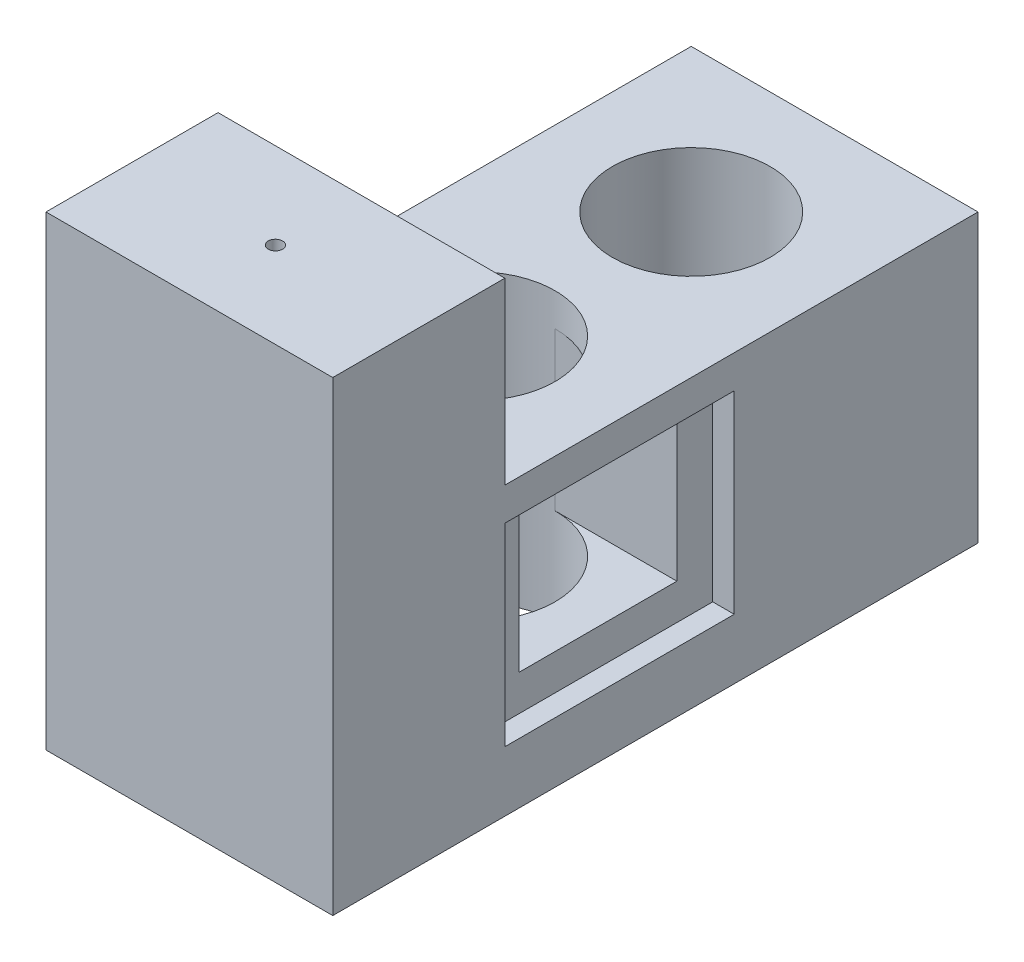
ISO-10303-21;
HEADER;
FILE_DESCRIPTION(('STEP AP214'),'2;1');
FILE_NAME('part.step','',(''),(''),'','','');
FILE_SCHEMA(('AUTOMOTIVE_DESIGN { 1 0 10303 214 1 1 1 1 }'));
ENDSEC;
DATA;
#1=APPLICATION_CONTEXT('core data for automotive mechanical design processes');
#2=APPLICATION_PROTOCOL_DEFINITION('international standard','automotive_design',2000,#1);
#3=PRODUCT_CONTEXT('',#1,'mechanical');
#4=PRODUCT('Part','Part','',(#3));
#5=PRODUCT_RELATED_PRODUCT_CATEGORY('part','',(#4));
#6=PRODUCT_DEFINITION_FORMATION('','',#4);
#7=PRODUCT_DEFINITION_CONTEXT('part definition',#1,'design');
#8=PRODUCT_DEFINITION('design','',#6,#7);
#9=PRODUCT_DEFINITION_SHAPE('','',#8);
#10=(LENGTH_UNIT() NAMED_UNIT(*) SI_UNIT(.MILLI.,.METRE.));
#11=(NAMED_UNIT(*) PLANE_ANGLE_UNIT() SI_UNIT($,.RADIAN.));
#12=(NAMED_UNIT(*) SI_UNIT($,.STERADIAN.) SOLID_ANGLE_UNIT());
#13=UNCERTAINTY_MEASURE_WITH_UNIT(LENGTH_MEASURE(1.E-05),#10,'distance_accuracy_value','');
#14=(GEOMETRIC_REPRESENTATION_CONTEXT(3) GLOBAL_UNCERTAINTY_ASSIGNED_CONTEXT((#13)) GLOBAL_UNIT_ASSIGNED_CONTEXT((#10,
#11,#12)) REPRESENTATION_CONTEXT('',''));
#15=CARTESIAN_POINT('',(0.,0.,0.));
#16=DIRECTION('',(0.,0.,1.));
#17=DIRECTION('',(1.,0.,0.));
#18=AXIS2_PLACEMENT_3D('',#15,#16,#17);
#19=CARTESIAN_POINT('',(-428.226450017831,17.7,-13.030180121313));
#20=DIRECTION('',(0.,0.,1.));
#21=DIRECTION('',(1.,0.,0.));
#22=AXIS2_PLACEMENT_3D('',#19,#20,#21);
#23=PLANE('',#22);
#24=DIRECTION('',(0.,1.,0.));
#25=VECTOR('',#24,1.);
#26=CARTESIAN_POINT('',(-419.726450017831,17.7,-13.030180121313));
#27=LINE('',#26,#25);
#28=CARTESIAN_POINT('',(-419.726450017831,6.69999999999999,-13.030180121313));
#29=VERTEX_POINT('',#28);
#30=CARTESIAN_POINT('',(-419.726450017831,17.7,-13.030180121313));
#31=VERTEX_POINT('',#30);
#32=EDGE_CURVE('E184',#29,#31,#27,.T.);
#33=ORIENTED_EDGE('',*,*,#32,.F.);
#34=DIRECTION('',(1.,0.,0.));
#35=VECTOR('',#34,1.);
#36=CARTESIAN_POINT('',(-428.226450017831,6.69999999999999,-13.030180121313));
#37=LINE('',#36,#35);
#38=CARTESIAN_POINT('',(-428.226450017831,6.69999999999999,-13.030180121313));
#39=VERTEX_POINT('',#38);
#40=EDGE_CURVE('E192',#39,#29,#37,.T.);
#41=ORIENTED_EDGE('',*,*,#40,.F.);
#42=DIRECTION('',(0.,-1.,0.));
#43=VECTOR('',#42,1.);
#44=CARTESIAN_POINT('',(-428.226450017831,17.7,-13.030180121313));
#45=LINE('',#44,#43);
#46=CARTESIAN_POINT('',(-428.226450017831,17.7,-13.030180121313));
#47=VERTEX_POINT('',#46);
#48=EDGE_CURVE('E186',#47,#39,#45,.T.);
#49=ORIENTED_EDGE('',*,*,#48,.F.);
#50=DIRECTION('',(1.,0.,0.));
#51=VECTOR('',#50,1.);
#52=CARTESIAN_POINT('',(-428.226450017831,17.7,-13.030180121313));
#53=LINE('',#52,#51);
#54=EDGE_CURVE('E193',#47,#31,#53,.T.);
#55=ORIENTED_EDGE('',*,*,#54,.T.);
#56=EDGE_LOOP('',(#33,#41,#49,#55));
#57=FACE_BOUND('',#56,.T.);
#58=ADVANCED_FACE('F41',(#57),#23,.F.);
#59=CARTESIAN_POINT('',(-428.226450017831,17.7,-24.030180121313));
#60=DIRECTION('',(0.,0.,-1.));
#61=DIRECTION('',(-1.,0.,0.));
#62=AXIS2_PLACEMENT_3D('',#59,#60,#61);
#63=PLANE('',#62);
#64=DIRECTION('',(0.,-1.,0.));
#65=VECTOR('',#64,1.);
#66=CARTESIAN_POINT('',(-419.726450017831,17.7,-24.030180121313));
#67=LINE('',#66,#65);
#68=CARTESIAN_POINT('',(-419.726450017831,17.7,-24.030180121313));
#69=VERTEX_POINT('',#68);
#70=CARTESIAN_POINT('',(-419.726450017831,6.69999999999999,-24.030180121313));
#71=VERTEX_POINT('',#70);
#72=EDGE_CURVE('E55',#69,#71,#67,.T.);
#73=ORIENTED_EDGE('',*,*,#72,.F.);
#74=DIRECTION('',(1.,0.,0.));
#75=VECTOR('',#74,1.);
#76=CARTESIAN_POINT('',(-428.226450017831,17.7,-24.030180121313));
#77=LINE('',#76,#75);
#78=CARTESIAN_POINT('',(-428.226450017831,17.7,-24.030180121313));
#79=VERTEX_POINT('',#78);
#80=EDGE_CURVE('E62',#79,#69,#77,.T.);
#81=ORIENTED_EDGE('',*,*,#80,.F.);
#82=DIRECTION('',(0.,1.,0.));
#83=VECTOR('',#82,1.);
#84=CARTESIAN_POINT('',(-428.226450017831,17.7,-24.030180121313));
#85=LINE('',#84,#83);
#86=CARTESIAN_POINT('',(-428.226450017831,6.69999999999999,-24.030180121313));
#87=VERTEX_POINT('',#86);
#88=EDGE_CURVE('E189',#87,#79,#85,.T.);
#89=ORIENTED_EDGE('',*,*,#88,.F.);
#90=DIRECTION('',(1.,0.,0.));
#91=VECTOR('',#90,1.);
#92=CARTESIAN_POINT('',(-428.226450017831,6.69999999999999,-24.030180121313));
#93=LINE('',#92,#91);
#94=EDGE_CURVE('E198',#87,#71,#93,.T.);
#95=ORIENTED_EDGE('',*,*,#94,.T.);
#96=EDGE_LOOP('',(#73,#81,#89,#95));
#97=FACE_BOUND('',#96,.T.);
#98=ADVANCED_FACE('F283',(#97),#63,.F.);
#99=CARTESIAN_POINT('',(-428.226450017831,6.69999999999999,-24.030180121313));
#100=DIRECTION('',(0.,-1.,0.));
#101=DIRECTION('',(0.,0.,-1.));
#102=AXIS2_PLACEMENT_3D('',#99,#100,#101);
#103=PLANE('',#102);
#104=DIRECTION('',(0.,0.,1.));
#105=VECTOR('',#104,1.);
#106=CARTESIAN_POINT('',(-419.726450017831,6.69999999999999,-24.030180121313));
#107=LINE('',#106,#105);
#108=EDGE_CURVE('E12',#71,#29,#107,.T.);
#109=ORIENTED_EDGE('',*,*,#108,.F.);
#110=ORIENTED_EDGE('',*,*,#94,.F.);
#111=CARTESIAN_POINT('',(-428.226450017831,6.69999999999999,-18.530180121313));
#112=DIRECTION('',(0.,-1.,0.));
#113=DIRECTION('',(0.,0.,-1.));
#114=AXIS2_PLACEMENT_3D('',#111,#112,#113);
#115=CIRCLE('',#114,5.50000000000002);
#116=EDGE_CURVE('E268',#39,#87,#115,.F.);
#117=ORIENTED_EDGE('',*,*,#116,.F.);
#118=ORIENTED_EDGE('',*,*,#40,.T.);
#119=EDGE_LOOP('',(#109,#110,#117,#118));
#120=FACE_BOUND('',#119,.T.);
#121=ADVANCED_FACE('F282',(#120),#103,.F.);
#122=CARTESIAN_POINT('',(0.,20.,0.));
#123=DIRECTION('',(0.,-1.,0.));
#124=DIRECTION('',(0.,0.,-1.));
#125=AXIS2_PLACEMENT_3D('',#122,#123,#124);
#126=PLANE('',#125);
#127=CARTESIAN_POINT('',(-428.226450017831,20.,-18.530180121313));
#128=DIRECTION('',(0.,1.,0.));
#129=DIRECTION('',(0.,0.,1.));
#130=AXIS2_PLACEMENT_3D('',#127,#128,#129);
#131=CIRCLE('',#130,5.50000000000002);
#132=CARTESIAN_POINT('',(-428.226450017831,20.,-13.0301801213129));
#133=VERTEX_POINT('',#132);
#134=EDGE_CURVE('E209',#133,#133,#131,.T.);
#135=ORIENTED_EDGE('',*,*,#134,.F.);
#136=EDGE_LOOP('',(#135));
#137=FACE_BOUND('',#136,.T.);
#138=CARTESIAN_POINT('',(-428.226450017831,20.,-33.530180121313));
#139=DIRECTION('',(0.,1.,0.));
#140=DIRECTION('',(0.,0.,1.));
#141=AXIS2_PLACEMENT_3D('',#138,#139,#140);
#142=CIRCLE('',#141,5.50000000000002);
#143=CARTESIAN_POINT('',(-428.226450017831,20.,-28.0301801213129));
#144=VERTEX_POINT('',#143);
#145=EDGE_CURVE('E212',#144,#144,#142,.T.);
#146=ORIENTED_EDGE('',*,*,#145,.F.);
#147=EDGE_LOOP('',(#146));
#148=FACE_BOUND('',#147,.T.);
#149=DIRECTION('',(-1.,0.,0.));
#150=VECTOR('',#149,1.);
#151=CARTESIAN_POINT('',(-418.226450017831,20.,-10.530180121313));
#152=LINE('',#151,#150);
#153=CARTESIAN_POINT('',(-418.226450017831,20.,-10.530180121313));
#154=VERTEX_POINT('',#153);
#155=CARTESIAN_POINT('',(-438.226450017831,20.,-10.530180121313));
#156=VERTEX_POINT('',#155);
#157=EDGE_CURVE('E219',#154,#156,#152,.T.);
#158=ORIENTED_EDGE('',*,*,#157,.F.);
#159=DIRECTION('',(0.,0.,-1.));
#160=VECTOR('',#159,1.);
#161=CARTESIAN_POINT('',(-418.226450017831,20.,-43.530180121313));
#162=LINE('',#161,#160);
#163=CARTESIAN_POINT('',(-418.226450017831,20.,-43.530180121313));
#164=VERTEX_POINT('',#163);
#165=EDGE_CURVE('E253',#154,#164,#162,.T.);
#166=ORIENTED_EDGE('',*,*,#165,.T.);
#167=DIRECTION('',(-1.,0.,0.));
#168=VECTOR('',#167,1.);
#169=CARTESIAN_POINT('',(-418.226450017831,20.,-43.530180121313));
#170=LINE('',#169,#168);
#171=CARTESIAN_POINT('',(-438.226450017831,20.,-43.530180121313));
#172=VERTEX_POINT('',#171);
#173=EDGE_CURVE('E256',#164,#172,#170,.T.);
#174=ORIENTED_EDGE('',*,*,#173,.T.);
#175=DIRECTION('',(0.,0.,1.));
#176=VECTOR('',#175,1.);
#177=CARTESIAN_POINT('',(-438.226450017831,20.,-43.530180121313));
#178=LINE('',#177,#176);
#179=EDGE_CURVE('E251',#172,#156,#178,.T.);
#180=ORIENTED_EDGE('',*,*,#179,.T.);
#181=EDGE_LOOP('',(#158,#166,#174,#180));
#182=FACE_BOUND('',#181,.T.);
#183=ADVANCED_FACE('F290',(#137,#148,#182),#126,.F.);
#184=CARTESIAN_POINT('',(0.,0.,0.));
#185=DIRECTION('',(0.,-1.,0.));
#186=DIRECTION('',(0.,0.,-1.));
#187=AXIS2_PLACEMENT_3D('',#184,#185,#186);
#188=PLANE('',#187);
#189=CARTESIAN_POINT('',(-428.226450017831,0.,-18.530180121313));
#190=DIRECTION('',(0.,1.,0.));
#191=DIRECTION('',(0.,0.,1.));
#192=AXIS2_PLACEMENT_3D('',#189,#190,#191);
#193=CIRCLE('',#192,5.50000000000002);
#194=CARTESIAN_POINT('',(-428.226450017831,0.,-13.0301801213129));
#195=VERTEX_POINT('',#194);
#196=EDGE_CURVE('E205',#195,#195,#193,.T.);
#197=ORIENTED_EDGE('',*,*,#196,.T.);
#198=EDGE_LOOP('',(#197));
#199=FACE_BOUND('',#198,.T.);
#200=CARTESIAN_POINT('',(-428.226450017831,0.,-33.530180121313));
#201=DIRECTION('',(0.,1.,0.));
#202=DIRECTION('',(0.,0.,1.));
#203=AXIS2_PLACEMENT_3D('',#200,#201,#202);
#204=CIRCLE('',#203,5.50000000000002);
#205=CARTESIAN_POINT('',(-428.226450017831,0.,-28.0301801213129));
#206=VERTEX_POINT('',#205);
#207=EDGE_CURVE('E204',#206,#206,#204,.T.);
#208=ORIENTED_EDGE('',*,*,#207,.T.);
#209=EDGE_LOOP('',(#208));
#210=FACE_BOUND('',#209,.T.);
#211=CARTESIAN_POINT('',(-428.226450017831,0.,-4.53018012131296));
#212=DIRECTION('',(0.,-1.,0.));
#213=DIRECTION('',(0.,0.,-1.));
#214=AXIS2_PLACEMENT_3D('',#211,#212,#213);
#215=CIRCLE('',#214,0.500000000000026);
#216=CARTESIAN_POINT('',(-428.226450017831,0.,-5.03018012131298));
#217=VERTEX_POINT('',#216);
#218=EDGE_CURVE('E239',#217,#217,#215,.F.);
#219=ORIENTED_EDGE('',*,*,#218,.T.);
#220=EDGE_LOOP('',(#219));
#221=FACE_BOUND('',#220,.T.);
#222=DIRECTION('',(0.,0.,1.));
#223=VECTOR('',#222,1.);
#224=CARTESIAN_POINT('',(-438.226450017831,0.,-43.530180121313));
#225=LINE('',#224,#223);
#226=CARTESIAN_POINT('',(-438.226450017831,0.,-43.530180121313));
#227=VERTEX_POINT('',#226);
#228=CARTESIAN_POINT('',(-438.226450017831,0.,1.46981987868704));
#229=VERTEX_POINT('',#228);
#230=EDGE_CURVE('E250',#227,#229,#225,.T.);
#231=ORIENTED_EDGE('',*,*,#230,.F.);
#232=DIRECTION('',(-1.,0.,0.));
#233=VECTOR('',#232,1.);
#234=CARTESIAN_POINT('',(-418.226450017831,0.,-43.530180121313));
#235=LINE('',#234,#233);
#236=CARTESIAN_POINT('',(-418.226450017831,0.,-43.530180121313));
#237=VERTEX_POINT('',#236);
#238=EDGE_CURVE('E254',#237,#227,#235,.T.);
#239=ORIENTED_EDGE('',*,*,#238,.F.);
#240=DIRECTION('',(0.,0.,-1.));
#241=VECTOR('',#240,1.);
#242=CARTESIAN_POINT('',(-418.226450017831,0.,-43.530180121313));
#243=LINE('',#242,#241);
#244=CARTESIAN_POINT('',(-418.226450017831,0.,1.46981987868704));
#245=VERTEX_POINT('',#244);
#246=EDGE_CURVE('E260',#245,#237,#243,.T.);
#247=ORIENTED_EDGE('',*,*,#246,.F.);
#248=DIRECTION('',(1.,0.,0.));
#249=VECTOR('',#248,1.);
#250=CARTESIAN_POINT('',(-438.226450017831,0.,1.46981987868704));
#251=LINE('',#250,#249);
#252=EDGE_CURVE('E245',#229,#245,#251,.T.);
#253=ORIENTED_EDGE('',*,*,#252,.F.);
#254=EDGE_LOOP('',(#231,#239,#247,#253));
#255=FACE_BOUND('',#254,.T.);
#256=ADVANCED_FACE('F321',(#199,#210,#221,#255),#188,.T.);
#257=CARTESIAN_POINT('',(-438.226450017831,20.,-43.530180121313));
#258=DIRECTION('',(1.,0.,0.));
#259=DIRECTION('',(0.,0.,-1.));
#260=AXIS2_PLACEMENT_3D('',#257,#258,#259);
#261=PLANE('',#260);
#262=ORIENTED_EDGE('',*,*,#230,.T.);
#263=DIRECTION('',(0.,-1.,0.));
#264=VECTOR('',#263,1.);
#265=CARTESIAN_POINT('',(-438.226450017831,20.,1.46981987868704));
#266=LINE('',#265,#264);
#267=CARTESIAN_POINT('',(-438.226450017831,32.5,1.46981987868704));
#268=VERTEX_POINT('',#267);
#269=EDGE_CURVE('E242',#268,#229,#266,.T.);
#270=ORIENTED_EDGE('',*,*,#269,.F.);
#271=DIRECTION('',(0.,0.,1.));
#272=VECTOR('',#271,1.);
#273=CARTESIAN_POINT('',(-438.226450017831,32.5,1.46981987868704));
#274=LINE('',#273,#272);
#275=CARTESIAN_POINT('',(-438.226450017831,32.5,-10.530180121313));
#276=VERTEX_POINT('',#275);
#277=EDGE_CURVE('E225',#276,#268,#274,.T.);
#278=ORIENTED_EDGE('',*,*,#277,.F.);
#279=DIRECTION('',(0.,-1.,0.));
#280=VECTOR('',#279,1.);
#281=CARTESIAN_POINT('',(-438.226450017831,32.5,-10.530180121313));
#282=LINE('',#281,#280);
#283=EDGE_CURVE('E231',#276,#156,#282,.T.);
#284=ORIENTED_EDGE('',*,*,#283,.T.);
#285=ORIENTED_EDGE('',*,*,#179,.F.);
#286=DIRECTION('',(0.,-1.,0.));
#287=VECTOR('',#286,1.);
#288=CARTESIAN_POINT('',(-438.226450017831,20.,-43.530180121313));
#289=LINE('',#288,#287);
#290=EDGE_CURVE('E258',#172,#227,#289,.T.);
#291=ORIENTED_EDGE('',*,*,#290,.T.);
#292=EDGE_LOOP('',(#262,#270,#278,#284,#285,#291));
#293=FACE_BOUND('',#292,.T.);
#294=ADVANCED_FACE('F43',(#293),#261,.F.);
#295=CARTESIAN_POINT('',(-418.226450017831,20.,-43.530180121313));
#296=DIRECTION('',(-1.,0.,0.));
#297=DIRECTION('',(0.,0.,1.));
#298=AXIS2_PLACEMENT_3D('',#295,#296,#297);
#299=PLANE('',#298);
#300=DIRECTION('',(0.,-1.,0.));
#301=VECTOR('',#300,1.);
#302=CARTESIAN_POINT('',(-418.226450017831,17.7,-10.530180121313));
#303=LINE('',#302,#301);
#304=CARTESIAN_POINT('',(-418.226450017831,17.7,-10.530180121313));
#305=VERTEX_POINT('',#304);
#306=CARTESIAN_POINT('',(-418.226450017831,4.19999999999999,-10.530180121313));
#307=VERTEX_POINT('',#306);
#308=EDGE_CURVE('E149',#305,#307,#303,.T.);
#309=ORIENTED_EDGE('',*,*,#308,.F.);
#310=DIRECTION('',(0.,0.,-1.));
#311=VECTOR('',#310,1.);
#312=CARTESIAN_POINT('',(-418.226450017831,17.7,-43.530180121313));
#313=LINE('',#312,#311);
#314=CARTESIAN_POINT('',(-418.226450017831,17.7,-26.530180121313));
#315=VERTEX_POINT('',#314);
#316=EDGE_CURVE('E196',#305,#315,#313,.T.);
#317=ORIENTED_EDGE('',*,*,#316,.T.);
#318=DIRECTION('',(0.,1.,0.));
#319=VECTOR('',#318,1.);
#320=CARTESIAN_POINT('',(-418.226450017831,17.7,-26.530180121313));
#321=LINE('',#320,#319);
#322=CARTESIAN_POINT('',(-418.226450017831,4.19999999999999,-26.530180121313));
#323=VERTEX_POINT('',#322);
#324=EDGE_CURVE('E167',#323,#315,#321,.T.);
#325=ORIENTED_EDGE('',*,*,#324,.F.);
#326=DIRECTION('',(0.,0.,-1.));
#327=VECTOR('',#326,1.);
#328=CARTESIAN_POINT('',(-418.226450017831,4.19999999999999,-10.530180121313));
#329=LINE('',#328,#327);
#330=EDGE_CURVE('E170',#307,#323,#329,.T.);
#331=ORIENTED_EDGE('',*,*,#330,.F.);
#332=EDGE_LOOP('',(#309,#317,#325,#331));
#333=FACE_BOUND('',#332,.T.);
#334=ORIENTED_EDGE('',*,*,#246,.T.);
#335=DIRECTION('',(0.,-1.,0.));
#336=VECTOR('',#335,1.);
#337=CARTESIAN_POINT('',(-418.226450017831,20.,-43.530180121313));
#338=LINE('',#337,#336);
#339=EDGE_CURVE('E265',#164,#237,#338,.T.);
#340=ORIENTED_EDGE('',*,*,#339,.F.);
#341=ORIENTED_EDGE('',*,*,#165,.F.);
#342=DIRECTION('',(0.,-1.,0.));
#343=VECTOR('',#342,1.);
#344=CARTESIAN_POINT('',(-418.226450017831,32.5,-10.530180121313));
#345=LINE('',#344,#343);
#346=CARTESIAN_POINT('',(-418.226450017831,32.5,-10.530180121313));
#347=VERTEX_POINT('',#346);
#348=EDGE_CURVE('E236',#347,#154,#345,.T.);
#349=ORIENTED_EDGE('',*,*,#348,.F.);
#350=DIRECTION('',(0.,0.,-1.));
#351=VECTOR('',#350,1.);
#352=CARTESIAN_POINT('',(-418.226450017831,32.5,1.46981987868704));
#353=LINE('',#352,#351);
#354=CARTESIAN_POINT('',(-418.226450017831,32.5,1.46981987868704));
#355=VERTEX_POINT('',#354);
#356=EDGE_CURVE('E220',#355,#347,#353,.T.);
#357=ORIENTED_EDGE('',*,*,#356,.F.);
#358=DIRECTION('',(0.,1.,0.));
#359=VECTOR('',#358,1.);
#360=CARTESIAN_POINT('',(-418.226450017831,20.,1.46981987868704));
#361=LINE('',#360,#359);
#362=EDGE_CURVE('E248',#245,#355,#361,.T.);
#363=ORIENTED_EDGE('',*,*,#362,.F.);
#364=EDGE_LOOP('',(#334,#340,#341,#349,#357,#363));
#365=FACE_BOUND('',#364,.T.);
#366=ADVANCED_FACE('F327',(#333,#365),#299,.F.);
#367=CARTESIAN_POINT('',(-418.226450017831,20.,-43.530180121313));
#368=DIRECTION('',(0.,0.,1.));
#369=DIRECTION('',(1.,0.,0.));
#370=AXIS2_PLACEMENT_3D('',#367,#368,#369);
#371=PLANE('',#370);
#372=ORIENTED_EDGE('',*,*,#238,.T.);
#373=ORIENTED_EDGE('',*,*,#290,.F.);
#374=ORIENTED_EDGE('',*,*,#173,.F.);
#375=ORIENTED_EDGE('',*,*,#339,.T.);
#376=EDGE_LOOP('',(#372,#373,#374,#375));
#377=FACE_BOUND('',#376,.T.);
#378=ADVANCED_FACE('F317',(#377),#371,.F.);
#379=CARTESIAN_POINT('',(0.,0.,1.46981987868704));
#380=DIRECTION('',(0.,0.,1.));
#381=DIRECTION('',(1.,0.,0.));
#382=AXIS2_PLACEMENT_3D('',#379,#380,#381);
#383=PLANE('',#382);
#384=ORIENTED_EDGE('',*,*,#269,.T.);
#385=ORIENTED_EDGE('',*,*,#252,.T.);
#386=ORIENTED_EDGE('',*,*,#362,.T.);
#387=DIRECTION('',(1.,0.,0.));
#388=VECTOR('',#387,1.);
#389=CARTESIAN_POINT('',(-418.226450017831,32.5,1.46981987868704));
#390=LINE('',#389,#388);
#391=EDGE_CURVE('E228',#268,#355,#390,.T.);
#392=ORIENTED_EDGE('',*,*,#391,.F.);
#393=EDGE_LOOP('',(#384,#385,#386,#392));
#394=FACE_BOUND('',#393,.T.);
#395=ADVANCED_FACE('F313',(#394),#383,.T.);
#396=CARTESIAN_POINT('',(-428.226450017831,-0.001000000000001,-4.53018012131296));
#397=DIRECTION('',(0.,1.,0.));
#398=DIRECTION('',(0.,0.,1.));
#399=AXIS2_PLACEMENT_3D('',#396,#397,#398);
#400=CYLINDRICAL_SURFACE('',#399,0.500000000000026);
#401=ORIENTED_EDGE('',*,*,#218,.F.);
#402=EDGE_LOOP('',(#401));
#403=FACE_BOUND('',#402,.T.);
#404=CARTESIAN_POINT('',(-428.226450017831,32.5,-4.53018012131296));
#405=DIRECTION('',(0.,1.,0.));
#406=DIRECTION('',(0.,0.,1.));
#407=AXIS2_PLACEMENT_3D('',#404,#405,#406);
#408=CIRCLE('',#407,0.500000000000026);
#409=CARTESIAN_POINT('',(-428.226450017831,32.5,-4.03018012131293));
#410=VERTEX_POINT('',#409);
#411=EDGE_CURVE('E208',#410,#410,#408,.T.);
#412=ORIENTED_EDGE('',*,*,#411,.T.);
#413=EDGE_LOOP('',(#412));
#414=FACE_BOUND('',#413,.T.);
#415=ADVANCED_FACE('F306',(#403,#414),#400,.F.);
#416=CARTESIAN_POINT('',(0.,32.5,0.));
#417=DIRECTION('',(0.,1.,0.));
#418=DIRECTION('',(0.,0.,1.));
#419=AXIS2_PLACEMENT_3D('',#416,#417,#418);
#420=PLANE('',#419);
#421=ORIENTED_EDGE('',*,*,#356,.T.);
#422=DIRECTION('',(-1.,0.,0.));
#423=VECTOR('',#422,1.);
#424=CARTESIAN_POINT('',(-418.226450017831,32.5,-10.530180121313));
#425=LINE('',#424,#423);
#426=EDGE_CURVE('E223',#347,#276,#425,.T.);
#427=ORIENTED_EDGE('',*,*,#426,.T.);
#428=ORIENTED_EDGE('',*,*,#277,.T.);
#429=ORIENTED_EDGE('',*,*,#391,.T.);
#430=EDGE_LOOP('',(#421,#427,#428,#429));
#431=FACE_BOUND('',#430,.T.);
#432=ORIENTED_EDGE('',*,*,#411,.F.);
#433=EDGE_LOOP('',(#432));
#434=FACE_BOUND('',#433,.T.);
#435=ADVANCED_FACE('F303',(#431,#434),#420,.T.);
#436=CARTESIAN_POINT('',(-418.226450017831,32.5,-10.530180121313));
#437=DIRECTION('',(0.,0.,1.));
#438=DIRECTION('',(1.,0.,0.));
#439=AXIS2_PLACEMENT_3D('',#436,#437,#438);
#440=PLANE('',#439);
#441=ORIENTED_EDGE('',*,*,#157,.T.);
#442=ORIENTED_EDGE('',*,*,#283,.F.);
#443=ORIENTED_EDGE('',*,*,#426,.F.);
#444=ORIENTED_EDGE('',*,*,#348,.T.);
#445=EDGE_LOOP('',(#441,#442,#443,#444));
#446=FACE_BOUND('',#445,.T.);
#447=ADVANCED_FACE('F301',(#446),#440,.F.);
#448=CARTESIAN_POINT('',(-428.226450017831,0.,-33.530180121313));
#449=DIRECTION('',(0.,1.,0.));
#450=DIRECTION('',(0.,0.,1.));
#451=AXIS2_PLACEMENT_3D('',#448,#449,#450);
#452=CYLINDRICAL_SURFACE('',#451,5.50000000000002);
#453=ORIENTED_EDGE('',*,*,#207,.F.);
#454=EDGE_LOOP('',(#453));
#455=FACE_BOUND('',#454,.T.);
#456=ORIENTED_EDGE('',*,*,#145,.T.);
#457=EDGE_LOOP('',(#456));
#458=FACE_BOUND('',#457,.T.);
#459=ADVANCED_FACE('F298',(#455,#458),#452,.F.);
#460=CARTESIAN_POINT('',(-428.226450017831,0.,-18.530180121313));
#461=DIRECTION('',(0.,1.,0.));
#462=DIRECTION('',(0.,0.,1.));
#463=AXIS2_PLACEMENT_3D('',#460,#461,#462);
#464=CYLINDRICAL_SURFACE('',#463,5.50000000000002);
#465=ORIENTED_EDGE('',*,*,#88,.T.);
#466=CARTESIAN_POINT('',(-428.226450017831,17.7,-18.530180121313));
#467=DIRECTION('',(0.,1.,0.));
#468=DIRECTION('',(0.,0.,1.));
#469=AXIS2_PLACEMENT_3D('',#466,#467,#468);
#470=CIRCLE('',#469,5.50000000000002);
#471=EDGE_CURVE('E49',#79,#47,#470,.F.);
#472=ORIENTED_EDGE('',*,*,#471,.T.);
#473=ORIENTED_EDGE('',*,*,#48,.T.);
#474=ORIENTED_EDGE('',*,*,#116,.T.);
#475=EDGE_LOOP('',(#465,#472,#473,#474));
#476=FACE_BOUND('',#475,.T.);
#477=ORIENTED_EDGE('',*,*,#196,.F.);
#478=EDGE_LOOP('',(#477));
#479=FACE_BOUND('',#478,.T.);
#480=ORIENTED_EDGE('',*,*,#134,.T.);
#481=EDGE_LOOP('',(#480));
#482=FACE_BOUND('',#481,.T.);
#483=ADVANCED_FACE('F272',(#476,#479,#482),#464,.F.);
#484=CARTESIAN_POINT('',(-428.226450017831,17.7,-24.030180121313));
#485=DIRECTION('',(0.,1.,0.));
#486=DIRECTION('',(0.,0.,1.));
#487=AXIS2_PLACEMENT_3D('',#484,#485,#486);
#488=PLANE('',#487);
#489=ORIENTED_EDGE('',*,*,#316,.F.);
#490=DIRECTION('',(1.,0.,0.));
#491=VECTOR('',#490,1.);
#492=CARTESIAN_POINT('',(-419.726450017831,17.7,-10.530180121313));
#493=LINE('',#492,#491);
#494=CARTESIAN_POINT('',(-419.726450017831,17.7,-10.530180121313));
#495=VERTEX_POINT('',#494);
#496=EDGE_CURVE('E177',#495,#305,#493,.T.);
#497=ORIENTED_EDGE('',*,*,#496,.F.);
#498=DIRECTION('',(0.,0.,1.));
#499=VECTOR('',#498,1.);
#500=CARTESIAN_POINT('',(-419.726450017831,17.7,-10.530180121313));
#501=LINE('',#500,#499);
#502=EDGE_CURVE('E165',#31,#495,#501,.T.);
#503=ORIENTED_EDGE('',*,*,#502,.F.);
#504=ORIENTED_EDGE('',*,*,#54,.F.);
#505=ORIENTED_EDGE('',*,*,#471,.F.);
#506=ORIENTED_EDGE('',*,*,#80,.T.);
#507=CARTESIAN_POINT('',(-419.726450017831,17.7,-26.530180121313));
#508=VERTEX_POINT('',#507);
#509=EDGE_CURVE('E154',#508,#69,#501,.T.);
#510=ORIENTED_EDGE('',*,*,#509,.F.);
#511=DIRECTION('',(1.,0.,0.));
#512=VECTOR('',#511,1.);
#513=CARTESIAN_POINT('',(-419.726450017831,17.7,-26.530180121313));
#514=LINE('',#513,#512);
#515=EDGE_CURVE('E179',#508,#315,#514,.T.);
#516=ORIENTED_EDGE('',*,*,#515,.T.);
#517=EDGE_LOOP('',(#489,#497,#503,#504,#505,#506,#510,#516));
#518=FACE_BOUND('',#517,.T.);
#519=ADVANCED_FACE('F276',(#518),#488,.F.);
#520=CARTESIAN_POINT('',(-419.726450017831,0.,0.));
#521=DIRECTION('',(1.,0.,0.));
#522=DIRECTION('',(0.,0.,-1.));
#523=AXIS2_PLACEMENT_3D('',#520,#521,#522);
#524=PLANE('',#523);
#525=ORIENTED_EDGE('',*,*,#32,.T.);
#526=ORIENTED_EDGE('',*,*,#502,.T.);
#527=DIRECTION('',(0.,-1.,0.));
#528=VECTOR('',#527,1.);
#529=CARTESIAN_POINT('',(-419.726450017831,17.7,-10.530180121313));
#530=LINE('',#529,#528);
#531=CARTESIAN_POINT('',(-419.726450017831,4.19999999999999,-10.530180121313));
#532=VERTEX_POINT('',#531);
#533=EDGE_CURVE('E147',#495,#532,#530,.T.);
#534=ORIENTED_EDGE('',*,*,#533,.T.);
#535=DIRECTION('',(0.,0.,-1.));
#536=VECTOR('',#535,1.);
#537=CARTESIAN_POINT('',(-419.726450017831,4.19999999999999,-10.530180121313));
#538=LINE('',#537,#536);
#539=CARTESIAN_POINT('',(-419.726450017831,4.19999999999999,-26.530180121313));
#540=VERTEX_POINT('',#539);
#541=EDGE_CURVE('E157',#532,#540,#538,.T.);
#542=ORIENTED_EDGE('',*,*,#541,.T.);
#543=DIRECTION('',(0.,1.,0.));
#544=VECTOR('',#543,1.);
#545=CARTESIAN_POINT('',(-419.726450017831,17.7,-26.530180121313));
#546=LINE('',#545,#544);
#547=EDGE_CURVE('E161',#540,#508,#546,.T.);
#548=ORIENTED_EDGE('',*,*,#547,.T.);
#549=ORIENTED_EDGE('',*,*,#509,.T.);
#550=ORIENTED_EDGE('',*,*,#72,.T.);
#551=ORIENTED_EDGE('',*,*,#108,.T.);
#552=EDGE_LOOP('',(#525,#526,#534,#542,#548,#549,#550,#551));
#553=FACE_BOUND('',#552,.T.);
#554=ADVANCED_FACE('F163',(#553),#524,.T.);
#555=CARTESIAN_POINT('',(-419.726450017831,17.7,-10.530180121313));
#556=DIRECTION('',(0.,0.,1.));
#557=DIRECTION('',(0.,-1.,0.));
#558=AXIS2_PLACEMENT_3D('',#555,#556,#557);
#559=PLANE('',#558);
#560=ORIENTED_EDGE('',*,*,#308,.T.);
#561=DIRECTION('',(1.,0.,0.));
#562=VECTOR('',#561,1.);
#563=CARTESIAN_POINT('',(-419.726450017831,4.19999999999999,-10.530180121313));
#564=LINE('',#563,#562);
#565=EDGE_CURVE('E142',#532,#307,#564,.T.);
#566=ORIENTED_EDGE('',*,*,#565,.F.);
#567=ORIENTED_EDGE('',*,*,#533,.F.);
#568=ORIENTED_EDGE('',*,*,#496,.T.);
#569=EDGE_LOOP('',(#560,#566,#567,#568));
#570=FACE_BOUND('',#569,.T.);
#571=ADVANCED_FACE('F144',(#570),#559,.F.);
#572=CARTESIAN_POINT('',(-419.726450017831,17.7,-26.530180121313));
#573=DIRECTION('',(0.,0.,-1.));
#574=DIRECTION('',(-1.,0.,0.));
#575=AXIS2_PLACEMENT_3D('',#572,#573,#574);
#576=PLANE('',#575);
#577=ORIENTED_EDGE('',*,*,#324,.T.);
#578=ORIENTED_EDGE('',*,*,#515,.F.);
#579=ORIENTED_EDGE('',*,*,#547,.F.);
#580=DIRECTION('',(1.,0.,0.));
#581=VECTOR('',#580,1.);
#582=CARTESIAN_POINT('',(-419.726450017831,4.19999999999999,-26.530180121313));
#583=LINE('',#582,#581);
#584=EDGE_CURVE('E153',#540,#323,#583,.T.);
#585=ORIENTED_EDGE('',*,*,#584,.T.);
#586=EDGE_LOOP('',(#577,#578,#579,#585));
#587=FACE_BOUND('',#586,.T.);
#588=ADVANCED_FACE('F358',(#587),#576,.F.);
#589=CARTESIAN_POINT('',(-419.726450017831,4.19999999999999,-10.530180121313));
#590=DIRECTION('',(0.,-1.,0.));
#591=DIRECTION('',(0.,0.,-1.));
#592=AXIS2_PLACEMENT_3D('',#589,#590,#591);
#593=PLANE('',#592);
#594=ORIENTED_EDGE('',*,*,#330,.T.);
#595=ORIENTED_EDGE('',*,*,#584,.F.);
#596=ORIENTED_EDGE('',*,*,#541,.F.);
#597=ORIENTED_EDGE('',*,*,#565,.T.);
#598=EDGE_LOOP('',(#594,#595,#596,#597));
#599=FACE_BOUND('',#598,.T.);
#600=ADVANCED_FACE('F158',(#599),#593,.F.);
#601=CLOSED_SHELL('',(#58,#98,#121,#183,#256,#294,#366,#378,#395,#415,#435,#447,#459,#483,#519,
#554,#571,#588,#600));
#602=MANIFOLD_SOLID_BREP('B2',#601);
#603=ADVANCED_BREP_SHAPE_REPRESENTATION('',(#18,#602),#14);
#604=SHAPE_DEFINITION_REPRESENTATION(#9,#603);
ENDSEC;
END-ISO-10303-21;
